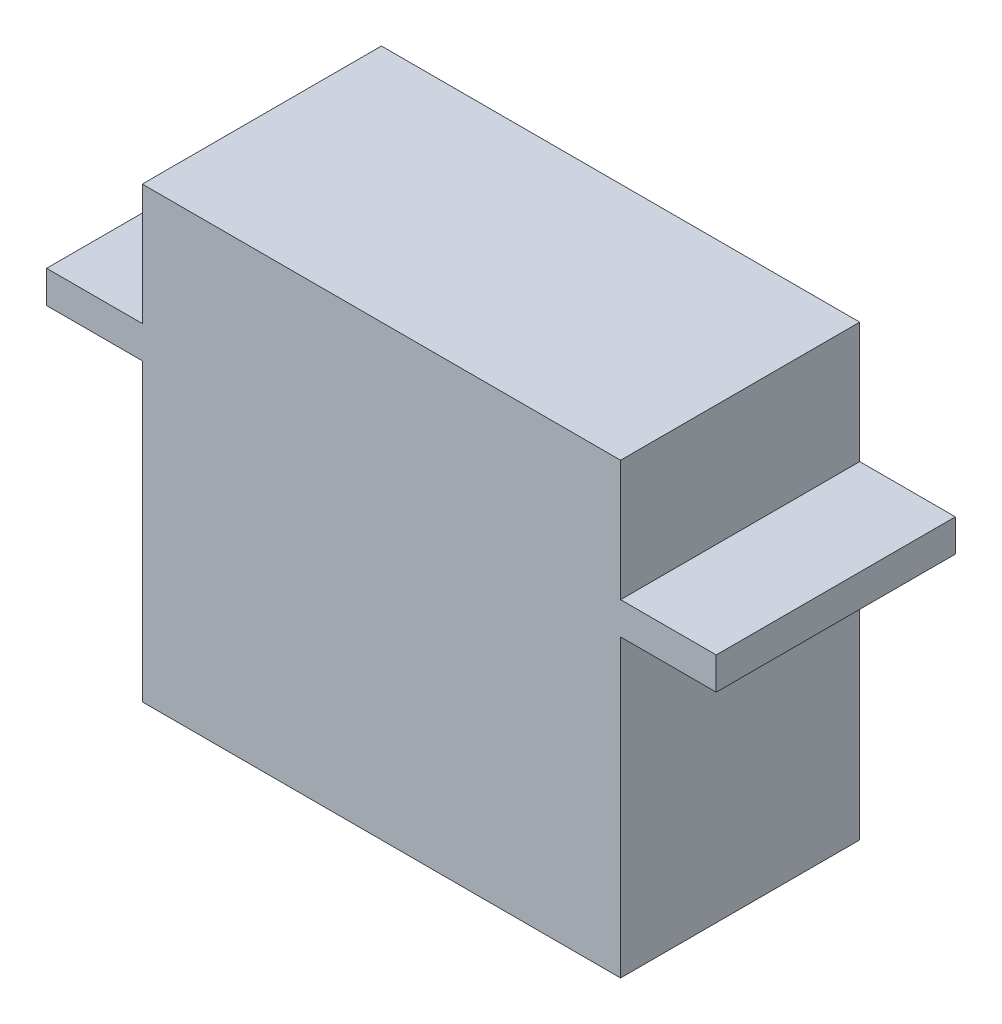
ISO-10303-21;
HEADER;
FILE_DESCRIPTION(('STEP AP214'),'2;1');
FILE_NAME('part.step','',(''),(''),'','','');
FILE_SCHEMA(('AUTOMOTIVE_DESIGN { 1 0 10303 214 1 1 1 1 }'));
ENDSEC;
DATA;
#1=APPLICATION_CONTEXT('core data for automotive mechanical design processes');
#2=APPLICATION_PROTOCOL_DEFINITION('international standard','automotive_design',2000,#1);
#3=PRODUCT_CONTEXT('',#1,'mechanical');
#4=PRODUCT('Part','Part','',(#3));
#5=PRODUCT_RELATED_PRODUCT_CATEGORY('part','',(#4));
#6=PRODUCT_DEFINITION_FORMATION('','',#4);
#7=PRODUCT_DEFINITION_CONTEXT('part definition',#1,'design');
#8=PRODUCT_DEFINITION('design','',#6,#7);
#9=PRODUCT_DEFINITION_SHAPE('','',#8);
#10=(LENGTH_UNIT() NAMED_UNIT(*) SI_UNIT(.MILLI.,.METRE.));
#11=(NAMED_UNIT(*) PLANE_ANGLE_UNIT() SI_UNIT($,.RADIAN.));
#12=(NAMED_UNIT(*) SI_UNIT($,.STERADIAN.) SOLID_ANGLE_UNIT());
#13=UNCERTAINTY_MEASURE_WITH_UNIT(LENGTH_MEASURE(1.E-05),#10,'distance_accuracy_value','');
#14=(GEOMETRIC_REPRESENTATION_CONTEXT(3) GLOBAL_UNCERTAINTY_ASSIGNED_CONTEXT((#13)) GLOBAL_UNIT_ASSIGNED_CONTEXT((#10,
#11,#12)) REPRESENTATION_CONTEXT('',''));
#15=CARTESIAN_POINT('',(0.,0.,0.));
#16=DIRECTION('',(0.,0.,1.));
#17=DIRECTION('',(1.,0.,0.));
#18=AXIS2_PLACEMENT_3D('',#15,#16,#17);
#19=CARTESIAN_POINT('',(0.,0.,20.));
#20=DIRECTION('',(0.,1.,0.));
#21=DIRECTION('',(0.,0.,1.));
#22=AXIS2_PLACEMENT_3D('',#19,#20,#21);
#23=PLANE('',#22);
#24=DIRECTION('',(0.,0.,-1.));
#25=VECTOR('',#24,1.);
#26=CARTESIAN_POINT('',(48.,0.,20.));
#27=LINE('',#26,#25);
#28=CARTESIAN_POINT('',(48.,0.,20.));
#29=VERTEX_POINT('',#28);
#30=CARTESIAN_POINT('',(48.,0.,0.));
#31=VERTEX_POINT('',#30);
#32=EDGE_CURVE('E176',#29,#31,#27,.T.);
#33=ORIENTED_EDGE('',*,*,#32,.F.);
#34=DIRECTION('',(1.,0.,0.));
#35=VECTOR('',#34,1.);
#36=CARTESIAN_POINT('',(0.,0.,20.));
#37=LINE('',#36,#35);
#38=CARTESIAN_POINT('',(8.,0.,20.));
#39=VERTEX_POINT('',#38);
#40=EDGE_CURVE('E205',#39,#29,#37,.T.);
#41=ORIENTED_EDGE('',*,*,#40,.F.);
#42=DIRECTION('',(0.,0.,1.));
#43=VECTOR('',#42,1.);
#44=CARTESIAN_POINT('',(8.,0.,0.));
#45=LINE('',#44,#43);
#46=CARTESIAN_POINT('',(8.,0.,0.));
#47=VERTEX_POINT('',#46);
#48=EDGE_CURVE('E192',#47,#39,#45,.T.);
#49=ORIENTED_EDGE('',*,*,#48,.F.);
#50=DIRECTION('',(1.,0.,0.));
#51=VECTOR('',#50,1.);
#52=CARTESIAN_POINT('',(0.,0.,0.));
#53=LINE('',#52,#51);
#54=EDGE_CURVE('E203',#47,#31,#53,.T.);
#55=ORIENTED_EDGE('',*,*,#54,.T.);
#56=EDGE_LOOP('',(#33,#41,#49,#55));
#57=FACE_BOUND('',#56,.T.);
#58=ADVANCED_FACE('F41',(#57),#23,.F.);
#59=CARTESIAN_POINT('',(56.,0.,20.));
#60=DIRECTION('',(-1.,0.,0.));
#61=DIRECTION('',(0.,0.,1.));
#62=AXIS2_PLACEMENT_3D('',#59,#60,#61);
#63=PLANE('',#62);
#64=DIRECTION('',(0.,1.,0.));
#65=VECTOR('',#64,1.);
#66=CARTESIAN_POINT('',(56.,0.,0.));
#67=LINE('',#66,#65);
#68=CARTESIAN_POINT('',(56.,24.7,0.));
#69=VERTEX_POINT('',#68);
#70=CARTESIAN_POINT('',(56.,27.4,0.));
#71=VERTEX_POINT('',#70);
#72=EDGE_CURVE('E214',#69,#71,#67,.T.);
#73=ORIENTED_EDGE('',*,*,#72,.T.);
#74=DIRECTION('',(0.,0.,-1.));
#75=VECTOR('',#74,1.);
#76=CARTESIAN_POINT('',(56.,27.4,20.));
#77=LINE('',#76,#75);
#78=CARTESIAN_POINT('',(56.,27.4,20.));
#79=VERTEX_POINT('',#78);
#80=EDGE_CURVE('E156',#79,#71,#77,.T.);
#81=ORIENTED_EDGE('',*,*,#80,.F.);
#82=DIRECTION('',(0.,1.,0.));
#83=VECTOR('',#82,1.);
#84=CARTESIAN_POINT('',(56.,0.,20.));
#85=LINE('',#84,#83);
#86=CARTESIAN_POINT('',(56.,24.7,20.));
#87=VERTEX_POINT('',#86);
#88=EDGE_CURVE('E208',#87,#79,#85,.T.);
#89=ORIENTED_EDGE('',*,*,#88,.F.);
#90=DIRECTION('',(0.,0.,1.));
#91=VECTOR('',#90,1.);
#92=CARTESIAN_POINT('',(56.,24.7,20.));
#93=LINE('',#92,#91);
#94=EDGE_CURVE('E171',#69,#87,#93,.T.);
#95=ORIENTED_EDGE('',*,*,#94,.F.);
#96=EDGE_LOOP('',(#73,#81,#89,#95));
#97=FACE_BOUND('',#96,.T.);
#98=ADVANCED_FACE('F253',(#97),#63,.F.);
#99=CARTESIAN_POINT('',(0.,37.5,20.));
#100=DIRECTION('',(0.,1.,0.));
#101=DIRECTION('',(0.,0.,1.));
#102=AXIS2_PLACEMENT_3D('',#99,#100,#101);
#103=PLANE('',#102);
#104=DIRECTION('',(0.,0.,1.));
#105=VECTOR('',#104,1.);
#106=CARTESIAN_POINT('',(8.,37.5,0.));
#107=LINE('',#106,#105);
#108=CARTESIAN_POINT('',(8.,37.5,0.));
#109=VERTEX_POINT('',#108);
#110=CARTESIAN_POINT('',(8.,37.5,20.));
#111=VERTEX_POINT('',#110);
#112=EDGE_CURVE('E57',#109,#111,#107,.T.);
#113=ORIENTED_EDGE('',*,*,#112,.T.);
#114=DIRECTION('',(1.,0.,0.));
#115=VECTOR('',#114,1.);
#116=CARTESIAN_POINT('',(0.,37.5,20.));
#117=LINE('',#116,#115);
#118=CARTESIAN_POINT('',(48.,37.5,20.));
#119=VERTEX_POINT('',#118);
#120=EDGE_CURVE('E49',#111,#119,#117,.T.);
#121=ORIENTED_EDGE('',*,*,#120,.T.);
#122=DIRECTION('',(0.,0.,-1.));
#123=VECTOR('',#122,1.);
#124=CARTESIAN_POINT('',(48.,37.5,20.));
#125=LINE('',#124,#123);
#126=CARTESIAN_POINT('',(48.,37.5,0.));
#127=VERTEX_POINT('',#126);
#128=EDGE_CURVE('E162',#119,#127,#125,.T.);
#129=ORIENTED_EDGE('',*,*,#128,.T.);
#130=DIRECTION('',(1.,0.,0.));
#131=VECTOR('',#130,1.);
#132=CARTESIAN_POINT('',(0.,37.5,0.));
#133=LINE('',#132,#131);
#134=EDGE_CURVE('E216',#109,#127,#133,.T.);
#135=ORIENTED_EDGE('',*,*,#134,.F.);
#136=EDGE_LOOP('',(#113,#121,#129,#135));
#137=FACE_BOUND('',#136,.T.);
#138=ADVANCED_FACE('F259',(#137),#103,.T.);
#139=CARTESIAN_POINT('',(0.,0.,20.));
#140=DIRECTION('',(-1.,0.,0.));
#141=DIRECTION('',(0.,0.,1.));
#142=AXIS2_PLACEMENT_3D('',#139,#140,#141);
#143=PLANE('',#142);
#144=DIRECTION('',(0.,0.,1.));
#145=VECTOR('',#144,1.);
#146=CARTESIAN_POINT('',(0.,27.4,0.));
#147=LINE('',#146,#145);
#148=CARTESIAN_POINT('',(0.,27.4,0.));
#149=VERTEX_POINT('',#148);
#150=CARTESIAN_POINT('',(0.,27.4,20.));
#151=VERTEX_POINT('',#150);
#152=EDGE_CURVE('E137',#149,#151,#147,.T.);
#153=ORIENTED_EDGE('',*,*,#152,.F.);
#154=DIRECTION('',(0.,1.,0.));
#155=VECTOR('',#154,1.);
#156=CARTESIAN_POINT('',(0.,0.,0.));
#157=LINE('',#156,#155);
#158=CARTESIAN_POINT('',(0.,24.7,0.));
#159=VERTEX_POINT('',#158);
#160=EDGE_CURVE('E44',#159,#149,#157,.T.);
#161=ORIENTED_EDGE('',*,*,#160,.F.);
#162=DIRECTION('',(0.,0.,-1.));
#163=VECTOR('',#162,1.);
#164=CARTESIAN_POINT('',(0.,24.7,0.));
#165=LINE('',#164,#163);
#166=CARTESIAN_POINT('',(0.,24.7,20.));
#167=VERTEX_POINT('',#166);
#168=EDGE_CURVE('E188',#167,#159,#165,.T.);
#169=ORIENTED_EDGE('',*,*,#168,.F.);
#170=DIRECTION('',(0.,1.,0.));
#171=VECTOR('',#170,1.);
#172=CARTESIAN_POINT('',(0.,0.,20.));
#173=LINE('',#172,#171);
#174=EDGE_CURVE('E11',#167,#151,#173,.T.);
#175=ORIENTED_EDGE('',*,*,#174,.T.);
#176=EDGE_LOOP('',(#153,#161,#169,#175));
#177=FACE_BOUND('',#176,.T.);
#178=ADVANCED_FACE('F226',(#177),#143,.T.);
#179=CARTESIAN_POINT('',(0.,0.,20.));
#180=DIRECTION('',(0.,0.,1.));
#181=DIRECTION('',(1.,0.,0.));
#182=AXIS2_PLACEMENT_3D('',#179,#180,#181);
#183=PLANE('',#182);
#184=DIRECTION('',(-1.,0.,0.));
#185=VECTOR('',#184,1.);
#186=CARTESIAN_POINT('',(8.,27.4,20.));
#187=LINE('',#186,#185);
#188=CARTESIAN_POINT('',(8.,27.4,20.));
#189=VERTEX_POINT('',#188);
#190=EDGE_CURVE('E132',#189,#151,#187,.T.);
#191=ORIENTED_EDGE('',*,*,#190,.T.);
#192=ORIENTED_EDGE('',*,*,#174,.F.);
#193=DIRECTION('',(-1.,0.,0.));
#194=VECTOR('',#193,1.);
#195=CARTESIAN_POINT('',(8.,24.7,20.));
#196=LINE('',#195,#194);
#197=CARTESIAN_POINT('',(8.,24.7,20.));
#198=VERTEX_POINT('',#197);
#199=EDGE_CURVE('E198',#198,#167,#196,.T.);
#200=ORIENTED_EDGE('',*,*,#199,.F.);
#201=DIRECTION('',(0.,1.,0.));
#202=VECTOR('',#201,1.);
#203=CARTESIAN_POINT('',(8.,24.7,20.));
#204=LINE('',#203,#202);
#205=EDGE_CURVE('E194',#39,#198,#204,.T.);
#206=ORIENTED_EDGE('',*,*,#205,.F.);
#207=ORIENTED_EDGE('',*,*,#40,.T.);
#208=DIRECTION('',(0.,-1.,0.));
#209=VECTOR('',#208,1.);
#210=CARTESIAN_POINT('',(48.,24.7,20.));
#211=LINE('',#210,#209);
#212=CARTESIAN_POINT('',(48.,24.7,20.));
#213=VERTEX_POINT('',#212);
#214=EDGE_CURVE('E174',#213,#29,#211,.T.);
#215=ORIENTED_EDGE('',*,*,#214,.F.);
#216=DIRECTION('',(1.,0.,0.));
#217=VECTOR('',#216,1.);
#218=CARTESIAN_POINT('',(48.,24.7,20.));
#219=LINE('',#218,#217);
#220=EDGE_CURVE('E185',#213,#87,#219,.T.);
#221=ORIENTED_EDGE('',*,*,#220,.T.);
#222=ORIENTED_EDGE('',*,*,#88,.T.);
#223=DIRECTION('',(1.,0.,0.));
#224=VECTOR('',#223,1.);
#225=CARTESIAN_POINT('',(48.,27.4,20.));
#226=LINE('',#225,#224);
#227=CARTESIAN_POINT('',(48.,27.4,20.));
#228=VERTEX_POINT('',#227);
#229=EDGE_CURVE('E169',#228,#79,#226,.T.);
#230=ORIENTED_EDGE('',*,*,#229,.F.);
#231=DIRECTION('',(0.,-1.,0.));
#232=VECTOR('',#231,1.);
#233=CARTESIAN_POINT('',(48.,37.5,20.));
#234=LINE('',#233,#232);
#235=EDGE_CURVE('E165',#119,#228,#234,.T.);
#236=ORIENTED_EDGE('',*,*,#235,.F.);
#237=ORIENTED_EDGE('',*,*,#120,.F.);
#238=DIRECTION('',(0.,-1.,0.));
#239=VECTOR('',#238,1.);
#240=CARTESIAN_POINT('',(8.,37.5,20.));
#241=LINE('',#240,#239);
#242=EDGE_CURVE('E145',#111,#189,#241,.T.);
#243=ORIENTED_EDGE('',*,*,#242,.T.);
#244=EDGE_LOOP('',(#191,#192,#200,#206,#207,#215,#221,#222,#230,#236,#237,#243));
#245=FACE_BOUND('',#244,.T.);
#246=ADVANCED_FACE('F149',(#245),#183,.T.);
#247=CARTESIAN_POINT('',(0.,0.,0.));
#248=DIRECTION('',(0.,0.,1.));
#249=DIRECTION('',(1.,0.,0.));
#250=AXIS2_PLACEMENT_3D('',#247,#248,#249);
#251=PLANE('',#250);
#252=ORIENTED_EDGE('',*,*,#160,.T.);
#253=DIRECTION('',(-1.,0.,0.));
#254=VECTOR('',#253,1.);
#255=CARTESIAN_POINT('',(8.,27.4,0.));
#256=LINE('',#255,#254);
#257=CARTESIAN_POINT('',(8.,27.4,0.));
#258=VERTEX_POINT('',#257);
#259=EDGE_CURVE('E141',#258,#149,#256,.T.);
#260=ORIENTED_EDGE('',*,*,#259,.F.);
#261=DIRECTION('',(0.,-1.,0.));
#262=VECTOR('',#261,1.);
#263=CARTESIAN_POINT('',(8.,37.5,0.));
#264=LINE('',#263,#262);
#265=EDGE_CURVE('E142',#109,#258,#264,.T.);
#266=ORIENTED_EDGE('',*,*,#265,.F.);
#267=ORIENTED_EDGE('',*,*,#134,.T.);
#268=DIRECTION('',(0.,-1.,0.));
#269=VECTOR('',#268,1.);
#270=CARTESIAN_POINT('',(48.,37.5,0.));
#271=LINE('',#270,#269);
#272=CARTESIAN_POINT('',(48.,27.4,0.));
#273=VERTEX_POINT('',#272);
#274=EDGE_CURVE('E159',#127,#273,#271,.T.);
#275=ORIENTED_EDGE('',*,*,#274,.T.);
#276=DIRECTION('',(1.,0.,0.));
#277=VECTOR('',#276,1.);
#278=CARTESIAN_POINT('',(48.,27.4,0.));
#279=LINE('',#278,#277);
#280=EDGE_CURVE('E167',#273,#71,#279,.T.);
#281=ORIENTED_EDGE('',*,*,#280,.T.);
#282=ORIENTED_EDGE('',*,*,#72,.F.);
#283=DIRECTION('',(1.,0.,0.));
#284=VECTOR('',#283,1.);
#285=CARTESIAN_POINT('',(48.,24.7,0.));
#286=LINE('',#285,#284);
#287=CARTESIAN_POINT('',(48.,24.7,0.));
#288=VERTEX_POINT('',#287);
#289=EDGE_CURVE('E183',#288,#69,#286,.T.);
#290=ORIENTED_EDGE('',*,*,#289,.F.);
#291=DIRECTION('',(0.,1.,0.));
#292=VECTOR('',#291,1.);
#293=CARTESIAN_POINT('',(48.,24.7,0.));
#294=LINE('',#293,#292);
#295=EDGE_CURVE('E178',#31,#288,#294,.T.);
#296=ORIENTED_EDGE('',*,*,#295,.F.);
#297=ORIENTED_EDGE('',*,*,#54,.F.);
#298=DIRECTION('',(0.,-1.,0.));
#299=VECTOR('',#298,1.);
#300=CARTESIAN_POINT('',(8.,24.7,0.));
#301=LINE('',#300,#299);
#302=CARTESIAN_POINT('',(8.,24.7,0.));
#303=VERTEX_POINT('',#302);
#304=EDGE_CURVE('E190',#303,#47,#301,.T.);
#305=ORIENTED_EDGE('',*,*,#304,.F.);
#306=DIRECTION('',(-1.,0.,0.));
#307=VECTOR('',#306,1.);
#308=CARTESIAN_POINT('',(8.,24.7,0.));
#309=LINE('',#308,#307);
#310=EDGE_CURVE('E200',#303,#159,#309,.T.);
#311=ORIENTED_EDGE('',*,*,#310,.T.);
#312=EDGE_LOOP('',(#252,#260,#266,#267,#275,#281,#282,#290,#296,#297,#305,#311));
#313=FACE_BOUND('',#312,.T.);
#314=ADVANCED_FACE('F221',(#313),#251,.F.);
#315=CARTESIAN_POINT('',(8.,24.7,0.));
#316=DIRECTION('',(0.,1.,0.));
#317=DIRECTION('',(0.,0.,1.));
#318=AXIS2_PLACEMENT_3D('',#315,#316,#317);
#319=PLANE('',#318);
#320=ORIENTED_EDGE('',*,*,#168,.T.);
#321=ORIENTED_EDGE('',*,*,#310,.F.);
#322=DIRECTION('',(0.,0.,-1.));
#323=VECTOR('',#322,1.);
#324=CARTESIAN_POINT('',(8.,24.7,0.));
#325=LINE('',#324,#323);
#326=EDGE_CURVE('E196',#198,#303,#325,.T.);
#327=ORIENTED_EDGE('',*,*,#326,.F.);
#328=ORIENTED_EDGE('',*,*,#199,.T.);
#329=EDGE_LOOP('',(#320,#321,#327,#328));
#330=FACE_BOUND('',#329,.T.);
#331=ADVANCED_FACE('F232',(#330),#319,.F.);
#332=CARTESIAN_POINT('',(8.,0.,0.));
#333=DIRECTION('',(-1.,0.,0.));
#334=DIRECTION('',(0.,0.,1.));
#335=AXIS2_PLACEMENT_3D('',#332,#333,#334);
#336=PLANE('',#335);
#337=ORIENTED_EDGE('',*,*,#304,.T.);
#338=ORIENTED_EDGE('',*,*,#48,.T.);
#339=ORIENTED_EDGE('',*,*,#205,.T.);
#340=ORIENTED_EDGE('',*,*,#326,.T.);
#341=EDGE_LOOP('',(#337,#338,#339,#340));
#342=FACE_BOUND('',#341,.T.);
#343=ADVANCED_FACE('F234',(#342),#336,.T.);
#344=CARTESIAN_POINT('',(48.,24.7,20.));
#345=DIRECTION('',(0.,1.,0.));
#346=DIRECTION('',(0.,0.,1.));
#347=AXIS2_PLACEMENT_3D('',#344,#345,#346);
#348=PLANE('',#347);
#349=ORIENTED_EDGE('',*,*,#94,.T.);
#350=ORIENTED_EDGE('',*,*,#220,.F.);
#351=DIRECTION('',(0.,0.,1.));
#352=VECTOR('',#351,1.);
#353=CARTESIAN_POINT('',(48.,24.7,20.));
#354=LINE('',#353,#352);
#355=EDGE_CURVE('E180',#288,#213,#354,.T.);
#356=ORIENTED_EDGE('',*,*,#355,.F.);
#357=ORIENTED_EDGE('',*,*,#289,.T.);
#358=EDGE_LOOP('',(#349,#350,#356,#357));
#359=FACE_BOUND('',#358,.T.);
#360=ADVANCED_FACE('F247',(#359),#348,.F.);
#361=CARTESIAN_POINT('',(48.,0.,0.));
#362=DIRECTION('',(1.,0.,0.));
#363=DIRECTION('',(0.,0.,-1.));
#364=AXIS2_PLACEMENT_3D('',#361,#362,#363);
#365=PLANE('',#364);
#366=ORIENTED_EDGE('',*,*,#214,.T.);
#367=ORIENTED_EDGE('',*,*,#32,.T.);
#368=ORIENTED_EDGE('',*,*,#295,.T.);
#369=ORIENTED_EDGE('',*,*,#355,.T.);
#370=EDGE_LOOP('',(#366,#367,#368,#369));
#371=FACE_BOUND('',#370,.T.);
#372=ADVANCED_FACE('F244',(#371),#365,.T.);
#373=CARTESIAN_POINT('',(48.,27.4,20.));
#374=DIRECTION('',(0.,-1.,0.));
#375=DIRECTION('',(0.,0.,-1.));
#376=AXIS2_PLACEMENT_3D('',#373,#374,#375);
#377=PLANE('',#376);
#378=ORIENTED_EDGE('',*,*,#80,.T.);
#379=ORIENTED_EDGE('',*,*,#280,.F.);
#380=DIRECTION('',(0.,0.,-1.));
#381=VECTOR('',#380,1.);
#382=CARTESIAN_POINT('',(48.,27.4,20.));
#383=LINE('',#382,#381);
#384=EDGE_CURVE('E65',#228,#273,#383,.T.);
#385=ORIENTED_EDGE('',*,*,#384,.F.);
#386=ORIENTED_EDGE('',*,*,#229,.T.);
#387=EDGE_LOOP('',(#378,#379,#385,#386));
#388=FACE_BOUND('',#387,.T.);
#389=ADVANCED_FACE('F255',(#388),#377,.F.);
#390=CARTESIAN_POINT('',(48.,0.,0.));
#391=DIRECTION('',(-1.,0.,0.));
#392=DIRECTION('',(0.,0.,1.));
#393=AXIS2_PLACEMENT_3D('',#390,#391,#392);
#394=PLANE('',#393);
#395=ORIENTED_EDGE('',*,*,#384,.T.);
#396=ORIENTED_EDGE('',*,*,#274,.F.);
#397=ORIENTED_EDGE('',*,*,#128,.F.);
#398=ORIENTED_EDGE('',*,*,#235,.T.);
#399=EDGE_LOOP('',(#395,#396,#397,#398));
#400=FACE_BOUND('',#399,.T.);
#401=ADVANCED_FACE('F257',(#400),#394,.F.);
#402=CARTESIAN_POINT('',(8.,27.4,0.));
#403=DIRECTION('',(0.,-1.,0.));
#404=DIRECTION('',(0.,0.,-1.));
#405=AXIS2_PLACEMENT_3D('',#402,#403,#404);
#406=PLANE('',#405);
#407=ORIENTED_EDGE('',*,*,#152,.T.);
#408=ORIENTED_EDGE('',*,*,#190,.F.);
#409=DIRECTION('',(0.,0.,1.));
#410=VECTOR('',#409,1.);
#411=CARTESIAN_POINT('',(8.,27.4,0.));
#412=LINE('',#411,#410);
#413=EDGE_CURVE('E135',#258,#189,#412,.T.);
#414=ORIENTED_EDGE('',*,*,#413,.F.);
#415=ORIENTED_EDGE('',*,*,#259,.T.);
#416=EDGE_LOOP('',(#407,#408,#414,#415));
#417=FACE_BOUND('',#416,.T.);
#418=ADVANCED_FACE('F134',(#417),#406,.F.);
#419=CARTESIAN_POINT('',(8.,0.,0.));
#420=DIRECTION('',(1.,0.,0.));
#421=DIRECTION('',(0.,0.,-1.));
#422=AXIS2_PLACEMENT_3D('',#419,#420,#421);
#423=PLANE('',#422);
#424=ORIENTED_EDGE('',*,*,#413,.T.);
#425=ORIENTED_EDGE('',*,*,#242,.F.);
#426=ORIENTED_EDGE('',*,*,#112,.F.);
#427=ORIENTED_EDGE('',*,*,#265,.T.);
#428=EDGE_LOOP('',(#424,#425,#426,#427));
#429=FACE_BOUND('',#428,.T.);
#430=ADVANCED_FACE('F144',(#429),#423,.F.);
#431=CLOSED_SHELL('',(#58,#98,#138,#178,#246,#314,#331,#343,#360,#372,#389,#401,#418,#430));
#432=MANIFOLD_SOLID_BREP('B2',#431);
#433=ADVANCED_BREP_SHAPE_REPRESENTATION('',(#18,#432),#14);
#434=SHAPE_DEFINITION_REPRESENTATION(#9,#433);
ENDSEC;
END-ISO-10303-21;
